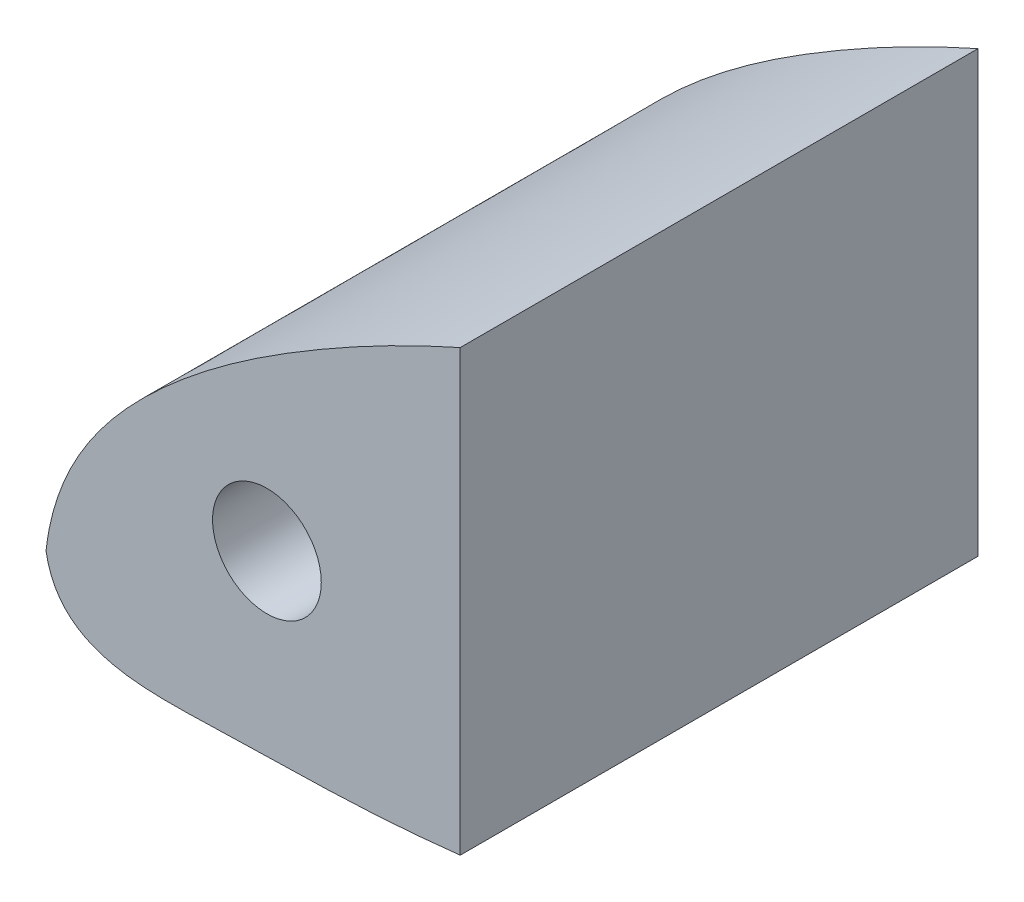
ISO-10303-21;
HEADER;
FILE_DESCRIPTION(('STEP AP214'),'2;1');
FILE_NAME('part.step','',(''),(''),'','','');
FILE_SCHEMA(('AUTOMOTIVE_DESIGN { 1 0 10303 214 1 1 1 1 }'));
ENDSEC;
DATA;
#1=APPLICATION_CONTEXT('core data for automotive mechanical design processes');
#2=APPLICATION_PROTOCOL_DEFINITION('international standard','automotive_design',2000,#1);
#3=PRODUCT_CONTEXT('',#1,'mechanical');
#4=PRODUCT('Part','Part','',(#3));
#5=PRODUCT_RELATED_PRODUCT_CATEGORY('part','',(#4));
#6=PRODUCT_DEFINITION_FORMATION('','',#4);
#7=PRODUCT_DEFINITION_CONTEXT('part definition',#1,'design');
#8=PRODUCT_DEFINITION('design','',#6,#7);
#9=PRODUCT_DEFINITION_SHAPE('','',#8);
#10=(LENGTH_UNIT() NAMED_UNIT(*) SI_UNIT(.MILLI.,.METRE.));
#11=(NAMED_UNIT(*) PLANE_ANGLE_UNIT() SI_UNIT($,.RADIAN.));
#12=(NAMED_UNIT(*) SI_UNIT($,.STERADIAN.) SOLID_ANGLE_UNIT());
#13=UNCERTAINTY_MEASURE_WITH_UNIT(LENGTH_MEASURE(1.E-05),#10,'distance_accuracy_value','');
#14=(GEOMETRIC_REPRESENTATION_CONTEXT(3) GLOBAL_UNCERTAINTY_ASSIGNED_CONTEXT((#13)) GLOBAL_UNIT_ASSIGNED_CONTEXT((#10,
#11,#12)) REPRESENTATION_CONTEXT('',''));
#15=CARTESIAN_POINT('',(0.,0.,0.));
#16=DIRECTION('',(0.,0.,1.));
#17=DIRECTION('',(1.,0.,0.));
#18=AXIS2_PLACEMENT_3D('',#15,#16,#17);
#19=CARTESIAN_POINT('',(0.000560351162113587,0.000130087070423624,47.625));
#20=CARTESIAN_POINT('',(1.23071418869678,-6.92407609127206,47.625));
#21=CARTESIAN_POINT('',(15.3166033306834,-6.18906584099094,47.625));
#22=CARTESIAN_POINT('',(36.4546728163185,-6.09849990105009,47.625));
#23=CARTESIAN_POINT('',(66.5061971849192,-0.586669106973501,47.625));
#24=CARTESIAN_POINT('',(110.497331171581,6.18149522271792,47.625));
#25=CARTESIAN_POINT('',(157.718638091679,9.03065014873911,47.625));
#26=CARTESIAN_POINT('',(205.10142463584,8.83808028186313,47.625));
#27=CARTESIAN_POINT('',(235.858814759408,7.87030619247826,47.625));
#28=CARTESIAN_POINT('',(260.846344817159,5.42741339404395,47.625));
#29=CARTESIAN_POINT('',(276.264022989737,4.51435670375389,47.625));
#30=CARTESIAN_POINT('',(293.989507544058,2.09398731346533,47.625));
#31=CARTESIAN_POINT('',(303.956832564589,1.47095520994628,47.625));
#32=CARTESIAN_POINT('',(309.846313894505,0.000130087070423666,47.625));
#33=B_SPLINE_CURVE_WITH_KNOTS('',3,(#19,#20,#21,#22,#23,#24,#25,#26,#27,#28,#29,#30,#31,#32),
.UNSPECIFIED.,.F.,.F.,(4,1,1,1,1,1,1,1,1,1,1,4),(0.,0.0569078595717698,0.106482711504673,
0.214488052979465,0.341297688349143,0.535095665520157,0.664680853556909,0.794660698192775,
0.828978881532905,0.904725108725214,0.942212919019968,1.),.UNSPECIFIED.);
#34=DIRECTION('',(0.,0.,-1.));
#35=VECTOR('',#34,1.);
#36=SURFACE_OF_LINEAR_EXTRUSION('',#33,#35);
#37=CARTESIAN_POINT('',(0.000560351162113587,0.000130087070423624,0.));
#38=CARTESIAN_POINT('',(1.23071418869678,-6.92407609127206,0.));
#39=CARTESIAN_POINT('',(15.3166033306834,-6.18906584099094,0.));
#40=CARTESIAN_POINT('',(36.4546728163185,-6.09849990105009,0.));
#41=CARTESIAN_POINT('',(66.5061971849192,-0.586669106973501,0.));
#42=CARTESIAN_POINT('',(110.497331171581,6.18149522271792,0.));
#43=CARTESIAN_POINT('',(157.718638091679,9.03065014873911,0.));
#44=CARTESIAN_POINT('',(205.10142463584,8.83808028186313,0.));
#45=CARTESIAN_POINT('',(235.858814759408,7.87030619247826,0.));
#46=CARTESIAN_POINT('',(260.846344817159,5.42741339404395,0.));
#47=CARTESIAN_POINT('',(276.264022989737,4.51435670375389,0.));
#48=CARTESIAN_POINT('',(293.989507544058,2.09398731346533,0.));
#49=CARTESIAN_POINT('',(303.956832564589,1.47095520994628,0.));
#50=CARTESIAN_POINT('',(309.846313894505,0.000130087070423666,0.));
#51=B_SPLINE_CURVE_WITH_KNOTS('',3,(#37,#38,#39,#40,#41,#42,#43,#44,#45,#46,#47,#48,#49,#50),
.UNSPECIFIED.,.F.,.F.,(4,1,1,1,1,1,1,1,1,1,1,4),(0.,0.0569078595717698,0.106482711504673,
0.214488052979465,0.341297688349143,0.535095665520157,0.664680853556909,0.794660698192775,
0.828978881532905,0.904725108725214,0.942212919019968,1.),.UNSPECIFIED.);
#52=CARTESIAN_POINT('',(0.000560351162116727,0.000130087070423829,0.));
#53=VERTEX_POINT('',#52);
#54=CARTESIAN_POINT('',(38.0999999979874,-5.18097252426853,0.));
#55=VERTEX_POINT('',#54);
#56=EDGE_CURVE('E100',#53,#55,#51,.T.);
#57=ORIENTED_EDGE('',*,*,#56,.T.);
#58=DIRECTION('',(0.,0.,-1.));
#59=VECTOR('',#58,1.);
#60=CARTESIAN_POINT('',(38.1,-5.18097252404465,47.625));
#61=LINE('',#60,#59);
#62=CARTESIAN_POINT('',(38.1,-5.18097252426854,47.625));
#63=VERTEX_POINT('',#62);
#64=EDGE_CURVE('E55',#55,#63,#61,.F.);
#65=ORIENTED_EDGE('',*,*,#64,.T.);
#66=CARTESIAN_POINT('',(0.000560351162116727,0.000130087070423829,47.625));
#67=VERTEX_POINT('',#66);
#68=EDGE_CURVE('E84',#67,#63,#33,.T.);
#69=ORIENTED_EDGE('',*,*,#68,.F.);
#70=DIRECTION('',(0.,0.,-1.));
#71=VECTOR('',#70,1.);
#72=CARTESIAN_POINT('',(0.000560351162116727,0.000130087070423829,47.625));
#73=LINE('',#72,#71);
#74=EDGE_CURVE('E11',#67,#53,#73,.T.);
#75=ORIENTED_EDGE('',*,*,#74,.T.);
#76=EDGE_LOOP('',(#57,#65,#69,#75));
#77=FACE_BOUND('',#76,.T.);
#78=ADVANCED_FACE('F39',(#77),#36,.F.);
#79=CARTESIAN_POINT('',(309.846313894505,0.000130087070423864,47.625));
#80=CARTESIAN_POINT('',(314.816918223261,-0.51620674157964,47.625));
#81=CARTESIAN_POINT('',(301.273197720551,4.38282813873556,47.625));
#82=CARTESIAN_POINT('',(290.359837670022,8.71099439045776,47.625));
#83=CARTESIAN_POINT('',(256.952064400645,19.5289209482833,47.625));
#84=CARTESIAN_POINT('',(217.961060472083,29.6129748944238,47.625));
#85=CARTESIAN_POINT('',(173.256699242147,40.0411042779434,47.625));
#86=CARTESIAN_POINT('',(131.400792108858,47.8848319151037,47.625));
#87=CARTESIAN_POINT('',(89.5976184754884,49.290763053775,47.625));
#88=CARTESIAN_POINT('',(52.1111282710831,42.0692152748914,47.625));
#89=CARTESIAN_POINT('',(26.2867198183782,29.9751763284633,47.625));
#90=CARTESIAN_POINT('',(8.64909202481883,17.8566051741579,47.625));
#91=CARTESIAN_POINT('',(0.810633126632263,7.35919605469637,47.625));
#92=CARTESIAN_POINT('',(0.000560351162116727,0.000130087070423829,47.625));
#93=B_SPLINE_CURVE_WITH_KNOTS('',3,(#79,#80,#81,#82,#83,#84,#85,#86,#87,#88,#89,#90,#91,#92),
.UNSPECIFIED.,.F.,.F.,(4,1,1,1,1,1,1,1,1,1,1,4),(0.,0.0239417713693992,0.070244030177139,
0.147561721425381,0.308455887006792,0.442387865106874,0.551517565626309,0.687091076796298,
0.811391258419108,0.886311735305172,0.939136382225768,1.),.UNSPECIFIED.);
#94=DIRECTION('',(0.,0.,-1.));
#95=VECTOR('',#94,1.);
#96=SURFACE_OF_LINEAR_EXTRUSION('',#93,#95);
#97=CARTESIAN_POINT('',(38.1,35.2581330206231,47.625));
#98=VERTEX_POINT('',#97);
#99=EDGE_CURVE('E48',#98,#67,#93,.T.);
#100=ORIENTED_EDGE('',*,*,#99,.F.);
#101=DIRECTION('',(0.,0.,-1.));
#102=VECTOR('',#101,1.);
#103=CARTESIAN_POINT('',(38.1,35.2581330224171,47.625));
#104=LINE('',#103,#102);
#105=CARTESIAN_POINT('',(38.1,35.2581330206231,0.));
#106=VERTEX_POINT('',#105);
#107=EDGE_CURVE('E74',#98,#106,#104,.T.);
#108=ORIENTED_EDGE('',*,*,#107,.T.);
#109=CARTESIAN_POINT('',(309.846313894505,0.000130087070423864,0.));
#110=CARTESIAN_POINT('',(314.816918223261,-0.51620674157964,0.));
#111=CARTESIAN_POINT('',(301.273197720551,4.38282813873556,0.));
#112=CARTESIAN_POINT('',(290.359837670022,8.71099439045776,0.));
#113=CARTESIAN_POINT('',(256.952064400645,19.5289209482833,0.));
#114=CARTESIAN_POINT('',(217.961060472083,29.6129748944238,0.));
#115=CARTESIAN_POINT('',(173.256699242147,40.0411042779434,0.));
#116=CARTESIAN_POINT('',(131.400792108858,47.8848319151037,0.));
#117=CARTESIAN_POINT('',(89.5976184754884,49.290763053775,0.));
#118=CARTESIAN_POINT('',(52.1111282710831,42.0692152748914,0.));
#119=CARTESIAN_POINT('',(26.2867198183782,29.9751763284633,0.));
#120=CARTESIAN_POINT('',(8.64909202481883,17.8566051741579,0.));
#121=CARTESIAN_POINT('',(0.810633126632263,7.35919605469637,0.));
#122=CARTESIAN_POINT('',(0.000560351162116727,0.000130087070423829,0.));
#123=B_SPLINE_CURVE_WITH_KNOTS('',3,(#109,#110,#111,#112,#113,#114,#115,#116,#117,#118,#119,
#120,#121,#122),.UNSPECIFIED.,.F.,.F.,(4,1,1,1,1,1,1,1,1,1,1,4),(0.,0.0239417713693992,
0.070244030177139,0.147561721425381,0.308455887006792,0.442387865106874,0.551517565626309,
0.687091076796298,0.811391258419108,0.886311735305172,0.939136382225768,1.),.UNSPECIFIED.);
#124=EDGE_CURVE('E91',#106,#53,#123,.T.);
#125=ORIENTED_EDGE('',*,*,#124,.T.);
#126=ORIENTED_EDGE('',*,*,#74,.F.);
#127=EDGE_LOOP('',(#100,#108,#125,#126));
#128=FACE_BOUND('',#127,.T.);
#129=ADVANCED_FACE('F87',(#128),#96,.F.);
#130=CARTESIAN_POINT('',(153.387816973495,8.33338198857885,47.625));
#131=DIRECTION('',(0.,0.,-1.));
#132=DIRECTION('',(-1.,0.,0.));
#133=AXIS2_PLACEMENT_3D('',#130,#131,#132);
#134=PLANE('',#133);
#135=CARTESIAN_POINT('',(20.32,10.16,47.625));
#136=DIRECTION('',(0.,0.,1.));
#137=DIRECTION('',(1.,0.,0.));
#138=AXIS2_PLACEMENT_3D('',#135,#136,#137);
#139=CIRCLE('',#138,5.);
#140=CARTESIAN_POINT('',(25.32,10.16,47.625));
#141=VERTEX_POINT('',#140);
#142=EDGE_CURVE('E133',#141,#141,#139,.T.);
#143=ORIENTED_EDGE('',*,*,#142,.F.);
#144=EDGE_LOOP('',(#143));
#145=FACE_BOUND('',#144,.T.);
#146=ORIENTED_EDGE('',*,*,#68,.T.);
#147=DIRECTION('',(0.,-1.,0.));
#148=VECTOR('',#147,1.);
#149=CARTESIAN_POINT('',(38.1,71.7179988353335,47.625));
#150=LINE('',#149,#148);
#151=EDGE_CURVE('E76',#98,#63,#150,.T.);
#152=ORIENTED_EDGE('',*,*,#151,.F.);
#153=ORIENTED_EDGE('',*,*,#99,.T.);
#154=EDGE_LOOP('',(#146,#152,#153));
#155=FACE_BOUND('',#154,.T.);
#156=ADVANCED_FACE('F82',(#145,#155),#134,.F.);
#157=CARTESIAN_POINT('',(153.387816973495,8.33338198857885,0.));
#158=DIRECTION('',(0.,0.,-1.));
#159=DIRECTION('',(-1.,0.,0.));
#160=AXIS2_PLACEMENT_3D('',#157,#158,#159);
#161=PLANE('',#160);
#162=DIRECTION('',(0.,-1.,0.));
#163=VECTOR('',#162,1.);
#164=CARTESIAN_POINT('',(38.1,71.7179988353335,0.));
#165=LINE('',#164,#163);
#166=EDGE_CURVE('E77',#106,#55,#165,.T.);
#167=ORIENTED_EDGE('',*,*,#166,.T.);
#168=ORIENTED_EDGE('',*,*,#56,.F.);
#169=ORIENTED_EDGE('',*,*,#124,.F.);
#170=EDGE_LOOP('',(#167,#168,#169));
#171=FACE_BOUND('',#170,.T.);
#172=CARTESIAN_POINT('',(20.32,10.16,0.));
#173=DIRECTION('',(0.,0.,1.));
#174=DIRECTION('',(1.,0.,0.));
#175=AXIS2_PLACEMENT_3D('',#172,#173,#174);
#176=CIRCLE('',#175,5.);
#177=CARTESIAN_POINT('',(25.32,10.16,0.));
#178=VERTEX_POINT('',#177);
#179=EDGE_CURVE('E129',#178,#178,#176,.T.);
#180=ORIENTED_EDGE('',*,*,#179,.T.);
#181=EDGE_LOOP('',(#180));
#182=FACE_BOUND('',#181,.T.);
#183=ADVANCED_FACE('F108',(#171,#182),#161,.T.);
#184=CARTESIAN_POINT('',(20.32,10.16,0.));
#185=DIRECTION('',(0.,0.,1.));
#186=DIRECTION('',(1.,0.,0.));
#187=AXIS2_PLACEMENT_3D('',#184,#185,#186);
#188=CYLINDRICAL_SURFACE('',#187,5.);
#189=ORIENTED_EDGE('',*,*,#179,.F.);
#190=EDGE_LOOP('',(#189));
#191=FACE_BOUND('',#190,.T.);
#192=ORIENTED_EDGE('',*,*,#142,.T.);
#193=EDGE_LOOP('',(#192));
#194=FACE_BOUND('',#193,.T.);
#195=ADVANCED_FACE('F111',(#191,#194),#188,.F.);
#196=CARTESIAN_POINT('',(38.1,71.7179988353335,0.));
#197=DIRECTION('',(-1.,0.,0.));
#198=DIRECTION('',(0.,-1.,0.));
#199=AXIS2_PLACEMENT_3D('',#196,#197,#198);
#200=PLANE('',#199);
#201=ORIENTED_EDGE('',*,*,#166,.F.);
#202=ORIENTED_EDGE('',*,*,#107,.F.);
#203=ORIENTED_EDGE('',*,*,#151,.T.);
#204=ORIENTED_EDGE('',*,*,#64,.F.);
#205=EDGE_LOOP('',(#201,#202,#203,#204));
#206=FACE_BOUND('',#205,.T.);
#207=ADVANCED_FACE('F75',(#206),#200,.F.);
#208=CLOSED_SHELL('',(#78,#129,#156,#183,#195,#207));
#209=MANIFOLD_SOLID_BREP('B2',#208);
#210=ADVANCED_BREP_SHAPE_REPRESENTATION('',(#18,#209),#14);
#211=SHAPE_DEFINITION_REPRESENTATION(#9,#210);
ENDSEC;
END-ISO-10303-21;
